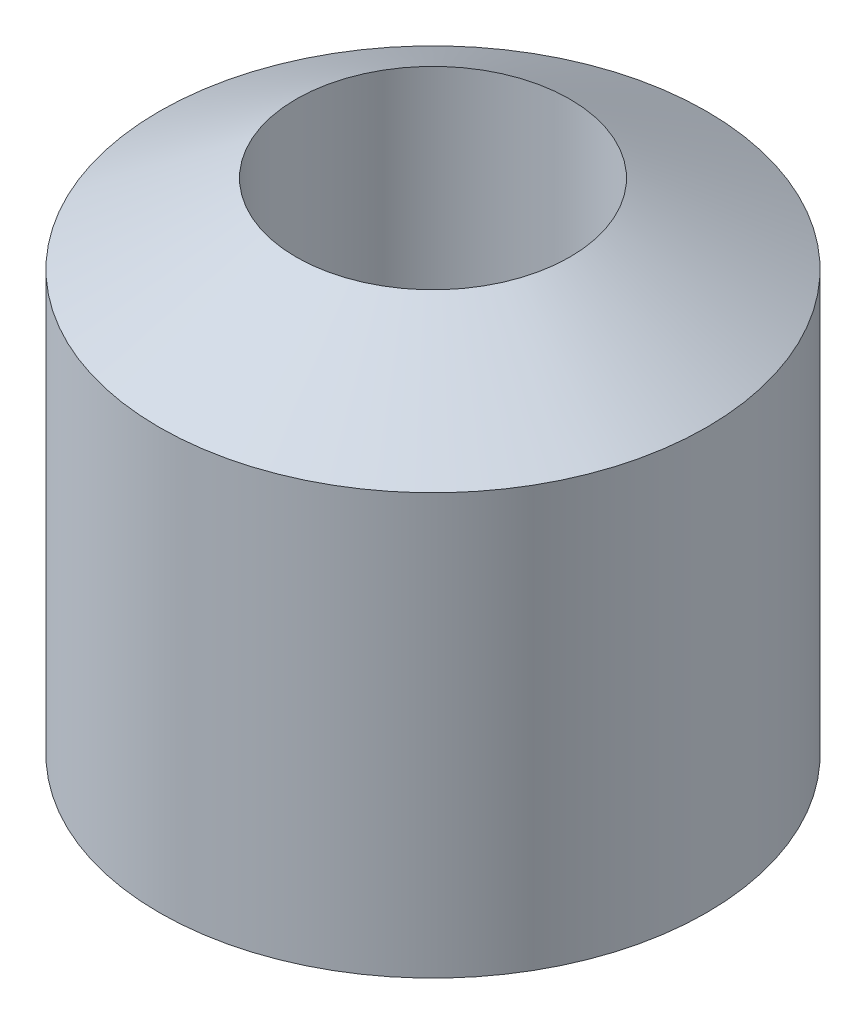
ISO-10303-21;
HEADER;
FILE_DESCRIPTION(('STEP AP214'),'2;1');
FILE_NAME('part.step','',(''),(''),'','','');
FILE_SCHEMA(('AUTOMOTIVE_DESIGN { 1 0 10303 214 1 1 1 1 }'));
ENDSEC;
DATA;
#1=APPLICATION_CONTEXT('core data for automotive mechanical design processes');
#2=APPLICATION_PROTOCOL_DEFINITION('international standard','automotive_design',2000,#1);
#3=PRODUCT_CONTEXT('',#1,'mechanical');
#4=PRODUCT('Part','Part','',(#3));
#5=PRODUCT_RELATED_PRODUCT_CATEGORY('part','',(#4));
#6=PRODUCT_DEFINITION_FORMATION('','',#4);
#7=PRODUCT_DEFINITION_CONTEXT('part definition',#1,'design');
#8=PRODUCT_DEFINITION('design','',#6,#7);
#9=PRODUCT_DEFINITION_SHAPE('','',#8);
#10=(LENGTH_UNIT() NAMED_UNIT(*) SI_UNIT(.MILLI.,.METRE.));
#11=(NAMED_UNIT(*) PLANE_ANGLE_UNIT() SI_UNIT($,.RADIAN.));
#12=(NAMED_UNIT(*) SI_UNIT($,.STERADIAN.) SOLID_ANGLE_UNIT());
#13=UNCERTAINTY_MEASURE_WITH_UNIT(LENGTH_MEASURE(1.E-05),#10,'distance_accuracy_value','');
#14=(GEOMETRIC_REPRESENTATION_CONTEXT(3) GLOBAL_UNCERTAINTY_ASSIGNED_CONTEXT((#13)) GLOBAL_UNIT_ASSIGNED_CONTEXT((#10,
#11,#12)) REPRESENTATION_CONTEXT('',''));
#15=CARTESIAN_POINT('',(0.,0.,0.));
#16=DIRECTION('',(0.,0.,1.));
#17=DIRECTION('',(1.,0.,0.));
#18=AXIS2_PLACEMENT_3D('',#15,#16,#17);
#19=CARTESIAN_POINT('',(0.,21.5,0.));
#20=DIRECTION('',(0.,-1.,0.));
#21=DIRECTION('',(0.,0.,-1.));
#22=AXIS2_PLACEMENT_3D('',#19,#20,#21);
#23=CONICAL_SURFACE('',#22,28.,1.04719755119659);
#24=CARTESIAN_POINT('',(0.,29.5829037686548,0.));
#25=DIRECTION('',(0.,-1.,0.));
#26=DIRECTION('',(0.,0.,-1.));
#27=AXIS2_PLACEMENT_3D('',#24,#25,#26);
#28=CIRCLE('',#27,14.);
#29=CARTESIAN_POINT('',(0.,29.5829037686548,-14.));
#30=VERTEX_POINT('',#29);
#31=EDGE_CURVE('E10',#30,#30,#28,.T.);
#32=ORIENTED_EDGE('',*,*,#31,.T.);
#33=EDGE_LOOP('',(#32));
#34=FACE_BOUND('',#33,.T.);
#35=CARTESIAN_POINT('',(0.,21.5,0.));
#36=DIRECTION('',(0.,-1.,0.));
#37=DIRECTION('',(0.,0.,-1.));
#38=AXIS2_PLACEMENT_3D('',#35,#36,#37);
#39=CIRCLE('',#38,28.);
#40=CARTESIAN_POINT('',(0.,21.5,-28.));
#41=VERTEX_POINT('',#40);
#42=EDGE_CURVE('E58',#41,#41,#39,.T.);
#43=ORIENTED_EDGE('',*,*,#42,.F.);
#44=EDGE_LOOP('',(#43));
#45=FACE_BOUND('',#44,.T.);
#46=ADVANCED_FACE('F41',(#34,#45),#23,.T.);
#47=CARTESIAN_POINT('',(0.,0.,0.));
#48=DIRECTION('',(0.,-1.,0.));
#49=DIRECTION('',(0.,0.,-1.));
#50=AXIS2_PLACEMENT_3D('',#47,#48,#49);
#51=CYLINDRICAL_SURFACE('',#50,14.);
#52=CARTESIAN_POINT('',(0.,-29.5829037686548,0.));
#53=DIRECTION('',(0.,-1.,0.));
#54=DIRECTION('',(0.,0.,-1.));
#55=AXIS2_PLACEMENT_3D('',#52,#53,#54);
#56=CIRCLE('',#55,14.);
#57=CARTESIAN_POINT('',(0.,-29.5829037686548,-14.));
#58=VERTEX_POINT('',#57);
#59=EDGE_CURVE('E48',#58,#58,#56,.T.);
#60=ORIENTED_EDGE('',*,*,#59,.T.);
#61=EDGE_LOOP('',(#60));
#62=FACE_BOUND('',#61,.T.);
#63=ORIENTED_EDGE('',*,*,#31,.F.);
#64=EDGE_LOOP('',(#63));
#65=FACE_BOUND('',#64,.T.);
#66=ADVANCED_FACE('F69',(#62,#65),#51,.F.);
#67=CARTESIAN_POINT('',(0.,-29.5829037686548,0.));
#68=DIRECTION('',(0.,1.,0.));
#69=DIRECTION('',(0.,0.,1.));
#70=AXIS2_PLACEMENT_3D('',#67,#68,#69);
#71=CONICAL_SURFACE('',#70,14.,1.04719755119659);
#72=CARTESIAN_POINT('',(0.,-21.5,0.));
#73=DIRECTION('',(0.,-1.,0.));
#74=DIRECTION('',(0.,0.,-1.));
#75=AXIS2_PLACEMENT_3D('',#72,#73,#74);
#76=CIRCLE('',#75,28.);
#77=CARTESIAN_POINT('',(0.,-21.5,-28.));
#78=VERTEX_POINT('',#77);
#79=EDGE_CURVE('E53',#78,#78,#76,.T.);
#80=ORIENTED_EDGE('',*,*,#79,.T.);
#81=EDGE_LOOP('',(#80));
#82=FACE_BOUND('',#81,.T.);
#83=ORIENTED_EDGE('',*,*,#59,.F.);
#84=EDGE_LOOP('',(#83));
#85=FACE_BOUND('',#84,.T.);
#86=ADVANCED_FACE('F73',(#82,#85),#71,.T.);
#87=CARTESIAN_POINT('',(0.,0.,0.));
#88=DIRECTION('',(0.,-1.,0.));
#89=DIRECTION('',(0.,0.,-1.));
#90=AXIS2_PLACEMENT_3D('',#87,#88,#89);
#91=CYLINDRICAL_SURFACE('',#90,28.);
#92=ORIENTED_EDGE('',*,*,#42,.T.);
#93=EDGE_LOOP('',(#92));
#94=FACE_BOUND('',#93,.T.);
#95=ORIENTED_EDGE('',*,*,#79,.F.);
#96=EDGE_LOOP('',(#95));
#97=FACE_BOUND('',#96,.T.);
#98=ADVANCED_FACE('F65',(#94,#97),#91,.T.);
#99=CLOSED_SHELL('',(#46,#66,#86,#98));
#100=MANIFOLD_SOLID_BREP('B2',#99);
#101=ADVANCED_BREP_SHAPE_REPRESENTATION('',(#18,#100),#14);
#102=SHAPE_DEFINITION_REPRESENTATION(#9,#101);
ENDSEC;
END-ISO-10303-21;
